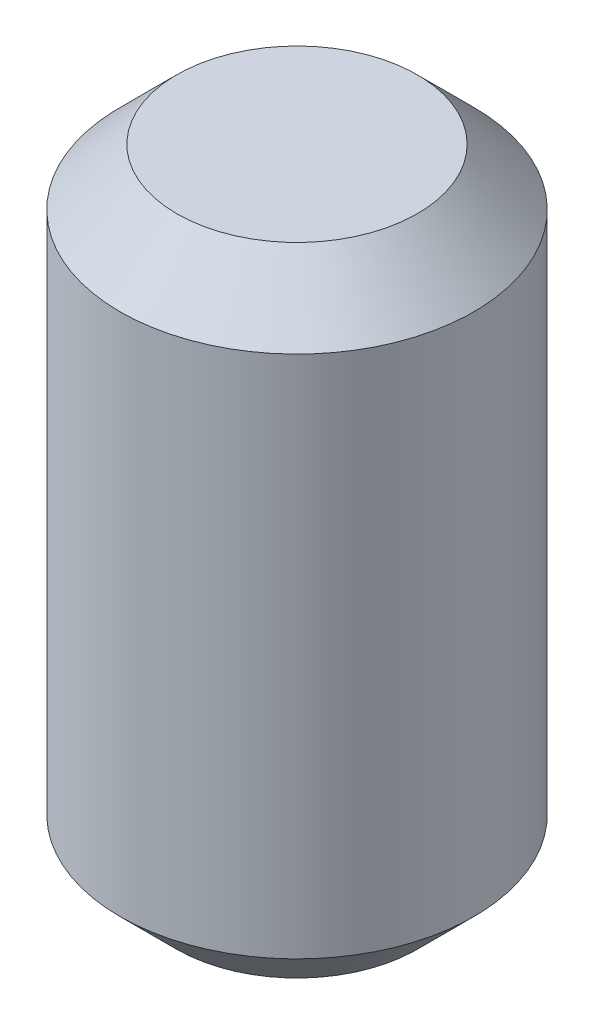
ISO-10303-21;
HEADER;
FILE_DESCRIPTION(('STEP AP214'),'2;1');
FILE_NAME('part.step','',(''),(''),'','','');
FILE_SCHEMA(('AUTOMOTIVE_DESIGN { 1 0 10303 214 1 1 1 1 }'));
ENDSEC;
DATA;
#1=APPLICATION_CONTEXT('core data for automotive mechanical design processes');
#2=APPLICATION_PROTOCOL_DEFINITION('international standard','automotive_design',2000,#1);
#3=PRODUCT_CONTEXT('',#1,'mechanical');
#4=PRODUCT('Part','Part','',(#3));
#5=PRODUCT_RELATED_PRODUCT_CATEGORY('part','',(#4));
#6=PRODUCT_DEFINITION_FORMATION('','',#4);
#7=PRODUCT_DEFINITION_CONTEXT('part definition',#1,'design');
#8=PRODUCT_DEFINITION('design','',#6,#7);
#9=PRODUCT_DEFINITION_SHAPE('','',#8);
#10=(LENGTH_UNIT() NAMED_UNIT(*) SI_UNIT(.MILLI.,.METRE.));
#11=(NAMED_UNIT(*) PLANE_ANGLE_UNIT() SI_UNIT($,.RADIAN.));
#12=(NAMED_UNIT(*) SI_UNIT($,.STERADIAN.) SOLID_ANGLE_UNIT());
#13=UNCERTAINTY_MEASURE_WITH_UNIT(LENGTH_MEASURE(1.E-05),#10,'distance_accuracy_value','');
#14=(GEOMETRIC_REPRESENTATION_CONTEXT(3) GLOBAL_UNCERTAINTY_ASSIGNED_CONTEXT((#13)) GLOBAL_UNIT_ASSIGNED_CONTEXT((#10,
#11,#12)) REPRESENTATION_CONTEXT('',''));
#15=CARTESIAN_POINT('',(0.,0.,0.));
#16=DIRECTION('',(0.,0.,1.));
#17=DIRECTION('',(1.,0.,0.));
#18=AXIS2_PLACEMENT_3D('',#15,#16,#17);
#19=CARTESIAN_POINT('',(0.,9.,0.));
#20=DIRECTION('',(0.,-1.,0.));
#21=DIRECTION('',(0.,0.,-1.));
#22=AXIS2_PLACEMENT_3D('',#19,#20,#21);
#23=CYLINDRICAL_SURFACE('',#22,2.5);
#24=CARTESIAN_POINT('',(0.,0.799999999999997,0.));
#25=DIRECTION('',(0.,1.,0.));
#26=DIRECTION('',(0.,0.,1.));
#27=AXIS2_PLACEMENT_3D('',#24,#25,#26);
#28=CIRCLE('',#27,2.5);
#29=CARTESIAN_POINT('',(0.,0.799999999999997,2.5));
#30=VERTEX_POINT('',#29);
#31=EDGE_CURVE('E42',#30,#30,#28,.T.);
#32=ORIENTED_EDGE('',*,*,#31,.T.);
#33=EDGE_LOOP('',(#32));
#34=FACE_BOUND('',#33,.T.);
#35=CARTESIAN_POINT('',(0.,8.2,0.));
#36=DIRECTION('',(0.,1.,0.));
#37=DIRECTION('',(0.,0.,1.));
#38=AXIS2_PLACEMENT_3D('',#35,#36,#37);
#39=CIRCLE('',#38,2.5);
#40=CARTESIAN_POINT('',(0.,8.2,2.5));
#41=VERTEX_POINT('',#40);
#42=EDGE_CURVE('E46',#41,#41,#39,.F.);
#43=ORIENTED_EDGE('',*,*,#42,.T.);
#44=EDGE_LOOP('',(#43));
#45=FACE_BOUND('',#44,.T.);
#46=ADVANCED_FACE('F31',(#34,#45),#23,.T.);
#47=CARTESIAN_POINT('',(0.,9.,0.));
#48=DIRECTION('',(0.,1.,0.));
#49=DIRECTION('',(0.,0.,1.));
#50=AXIS2_PLACEMENT_3D('',#47,#48,#49);
#51=PLANE('',#50);
#52=CARTESIAN_POINT('',(0.,9.,0.));
#53=DIRECTION('',(0.,1.,0.));
#54=DIRECTION('',(0.,0.,1.));
#55=AXIS2_PLACEMENT_3D('',#52,#53,#54);
#56=CIRCLE('',#55,1.7);
#57=CARTESIAN_POINT('',(0.,9.,1.7));
#58=VERTEX_POINT('',#57);
#59=EDGE_CURVE('E10',#58,#58,#56,.T.);
#60=ORIENTED_EDGE('',*,*,#59,.T.);
#61=EDGE_LOOP('',(#60));
#62=FACE_BOUND('',#61,.T.);
#63=ADVANCED_FACE('F62',(#62),#51,.T.);
#64=CARTESIAN_POINT('',(0.,0.,0.));
#65=DIRECTION('',(0.,1.,0.));
#66=DIRECTION('',(0.,0.,1.));
#67=AXIS2_PLACEMENT_3D('',#64,#65,#66);
#68=PLANE('',#67);
#69=CARTESIAN_POINT('',(0.,0.,0.));
#70=DIRECTION('',(0.,1.,0.));
#71=DIRECTION('',(0.,0.,1.));
#72=AXIS2_PLACEMENT_3D('',#69,#70,#71);
#73=CIRCLE('',#72,1.7);
#74=CARTESIAN_POINT('',(0.,0.,1.7));
#75=VERTEX_POINT('',#74);
#76=EDGE_CURVE('E38',#75,#75,#73,.F.);
#77=ORIENTED_EDGE('',*,*,#76,.T.);
#78=EDGE_LOOP('',(#77));
#79=FACE_BOUND('',#78,.T.);
#80=ADVANCED_FACE('F59',(#79),#68,.F.);
#81=CARTESIAN_POINT('',(0.,0.799999999999997,0.));
#82=DIRECTION('',(0.,1.,0.));
#83=DIRECTION('',(0.,0.,1.));
#84=AXIS2_PLACEMENT_3D('',#81,#82,#83);
#85=CONICAL_SURFACE('',#84,2.5,0.785398163397451);
#86=CARTESIAN_POINT('',(0.,0.,1.7));
#87=CARTESIAN_POINT('',(0.,0.00833333333333312,1.70833333333333));
#88=CARTESIAN_POINT('',(0.,0.0166666666666665,1.71666666666667));
#89=CARTESIAN_POINT('',(0.,0.0333333333333331,1.73333333333333));
#90=CARTESIAN_POINT('',(0.,0.0416666666666664,1.74166666666666));
#91=CARTESIAN_POINT('',(0.,0.058333333333333,1.75833333333333));
#92=CARTESIAN_POINT('',(0.,0.0666666666666663,1.76666666666666));
#93=CARTESIAN_POINT('',(0.,0.0833333333333329,1.78333333333333));
#94=CARTESIAN_POINT('',(0.,0.0916666666666662,1.79166666666666));
#95=CARTESIAN_POINT('',(0.,0.108333333333333,1.80833333333333));
#96=CARTESIAN_POINT('',(0.,0.116666666666666,1.81666666666667));
#97=CARTESIAN_POINT('',(0.,0.133333333333333,1.83333333333333));
#98=CARTESIAN_POINT('',(0.,0.141666666666666,1.84166666666667));
#99=CARTESIAN_POINT('',(0.,0.158333333333333,1.85833333333333));
#100=CARTESIAN_POINT('',(0.,0.166666666666666,1.86666666666667));
#101=CARTESIAN_POINT('',(0.,0.183333333333333,1.88333333333333));
#102=CARTESIAN_POINT('',(0.,0.191666666666666,1.89166666666667));
#103=CARTESIAN_POINT('',(0.,0.208333333333332,1.90833333333333));
#104=CARTESIAN_POINT('',(0.,0.216666666666666,1.91666666666667));
#105=CARTESIAN_POINT('',(0.,0.233333333333332,1.93333333333333));
#106=CARTESIAN_POINT('',(0.,0.241666666666666,1.94166666666667));
#107=CARTESIAN_POINT('',(0.,0.258333333333332,1.95833333333333));
#108=CARTESIAN_POINT('',(0.,0.266666666666666,1.96666666666667));
#109=CARTESIAN_POINT('',(0.,0.283333333333332,1.98333333333333));
#110=CARTESIAN_POINT('',(0.,0.291666666666666,1.99166666666666));
#111=CARTESIAN_POINT('',(0.,0.308333333333332,2.00833333333333));
#112=CARTESIAN_POINT('',(0.,0.316666666666665,2.01666666666667));
#113=CARTESIAN_POINT('',(0.,0.333333333333332,2.03333333333333));
#114=CARTESIAN_POINT('',(0.,0.341666666666665,2.04166666666667));
#115=CARTESIAN_POINT('',(0.,0.358333333333332,2.05833333333333));
#116=CARTESIAN_POINT('',(0.,0.366666666666665,2.06666666666667));
#117=CARTESIAN_POINT('',(0.,0.383333333333332,2.08333333333333));
#118=CARTESIAN_POINT('',(0.,0.391666666666665,2.09166666666667));
#119=CARTESIAN_POINT('',(0.,0.408333333333332,2.10833333333333));
#120=CARTESIAN_POINT('',(0.,0.416666666666665,2.11666666666667));
#121=CARTESIAN_POINT('',(0.,0.433333333333332,2.13333333333333));
#122=CARTESIAN_POINT('',(0.,0.441666666666665,2.14166666666667));
#123=CARTESIAN_POINT('',(0.,0.458333333333331,2.15833333333333));
#124=CARTESIAN_POINT('',(0.,0.466666666666665,2.16666666666667));
#125=CARTESIAN_POINT('',(0.,0.483333333333331,2.18333333333333));
#126=CARTESIAN_POINT('',(0.,0.491666666666665,2.19166666666667));
#127=CARTESIAN_POINT('',(0.,0.508333333333331,2.20833333333333));
#128=CARTESIAN_POINT('',(0.,0.516666666666665,2.21666666666667));
#129=CARTESIAN_POINT('',(0.,0.533333333333331,2.23333333333333));
#130=CARTESIAN_POINT('',(0.,0.541666666666665,2.24166666666667));
#131=CARTESIAN_POINT('',(0.,0.558333333333331,2.25833333333333));
#132=CARTESIAN_POINT('',(0.,0.566666666666664,2.26666666666667));
#133=CARTESIAN_POINT('',(0.,0.583333333333331,2.28333333333333));
#134=CARTESIAN_POINT('',(0.,0.591666666666664,2.29166666666667));
#135=CARTESIAN_POINT('',(0.,0.608333333333331,2.30833333333333));
#136=CARTESIAN_POINT('',(0.,0.616666666666664,2.31666666666667));
#137=CARTESIAN_POINT('',(0.,0.633333333333331,2.33333333333333));
#138=CARTESIAN_POINT('',(0.,0.641666666666664,2.34166666666667));
#139=CARTESIAN_POINT('',(0.,0.658333333333331,2.35833333333333));
#140=CARTESIAN_POINT('',(0.,0.666666666666664,2.36666666666667));
#141=CARTESIAN_POINT('',(0.,0.683333333333331,2.38333333333333));
#142=CARTESIAN_POINT('',(0.,0.691666666666664,2.39166666666667));
#143=CARTESIAN_POINT('',(0.,0.70833333333333,2.40833333333333));
#144=CARTESIAN_POINT('',(0.,0.716666666666664,2.41666666666667));
#145=CARTESIAN_POINT('',(0.,0.73333333333333,2.43333333333333));
#146=CARTESIAN_POINT('',(0.,0.741666666666664,2.44166666666667));
#147=CARTESIAN_POINT('',(0.,0.75833333333333,2.45833333333333));
#148=CARTESIAN_POINT('',(0.,0.766666666666663,2.46666666666667));
#149=CARTESIAN_POINT('',(0.,0.78333333333333,2.48333333333333));
#150=CARTESIAN_POINT('',(0.,0.791666666666664,2.49166666666667));
#151=CARTESIAN_POINT('',(0.,0.799999999999997,2.5));
#152=B_SPLINE_CURVE_WITH_KNOTS('',3,(#86,#87,#88,#89,#90,#91,#92,#93,#94,#95,#96,#97,#98,#99,
#100,#101,#102,#103,#104,#105,#106,#107,#108,#109,#110,#111,#112,#113,#114,#115,#116,#117,#118,
#119,#120,#121,#122,#123,#124,#125,#126,#127,#128,#129,#130,#131,#132,#133,#134,#135,#136,#137,
#138,#139,#140,#141,#142,#143,#144,#145,#146,#147,#148,#149,#150,#151),.UNSPECIFIED.,.F.,.F.,(4,
2,2,2,2,2,2,2,2,2,2,2,2,2,2,2,2,2,2,2,2,2,2,2,2,2,2,2,2,2,2,2,4),(0.,0.0353553390593275,
0.0707106781186547,0.106066017177982,0.141421356237309,0.176776695296637,0.212132034355964,
0.247487373415292,0.282842712474619,0.318198051533946,0.353553390593274,0.388908729652601,
0.424264068711928,0.459619407771256,0.494974746830583,0.53033008588991,0.565685424949237,
0.601040764008565,0.636396103067892,0.67175144212722,0.707106781186547,0.742462120245875,
0.777817459305202,0.813172798364529,0.848528137423856,0.883883476483184,0.919238815542511,
0.954594154601838,0.989949493661166,1.02530483272049,1.06066017177982,1.09601551083915,
1.13137084989848),.UNSPECIFIED.);
#153=EDGE_CURVE('BSEAM55',#75,#30,#152,.T.);
#154=ORIENTED_EDGE('',*,*,#76,.F.);
#155=ORIENTED_EDGE('',*,*,#31,.F.);
#156=ORIENTED_EDGE('',*,*,#153,.T.);
#157=ORIENTED_EDGE('',*,*,#153,.F.);
#158=EDGE_LOOP('',(#154,#156,#155,#157));
#159=FACE_BOUND('',#158,.T.);
#160=ADVANCED_FACE('F55',(#159),#85,.T.);
#161=CARTESIAN_POINT('',(0.,9.,0.));
#162=DIRECTION('',(0.,-1.,0.));
#163=DIRECTION('',(0.,0.,-1.));
#164=AXIS2_PLACEMENT_3D('',#161,#162,#163);
#165=CONICAL_SURFACE('',#164,1.7,0.785398163397447);
#166=ORIENTED_EDGE('',*,*,#42,.F.);
#167=EDGE_LOOP('',(#166));
#168=FACE_BOUND('',#167,.T.);
#169=ORIENTED_EDGE('',*,*,#59,.F.);
#170=EDGE_LOOP('',(#169));
#171=FACE_BOUND('',#170,.T.);
#172=ADVANCED_FACE('F33',(#168,#171),#165,.T.);
#173=CLOSED_SHELL('',(#46,#63,#80,#160,#172));
#174=MANIFOLD_SOLID_BREP('B2',#173);
#175=ADVANCED_BREP_SHAPE_REPRESENTATION('',(#18,#174),#14);
#176=SHAPE_DEFINITION_REPRESENTATION(#9,#175);
ENDSEC;
END-ISO-10303-21;
